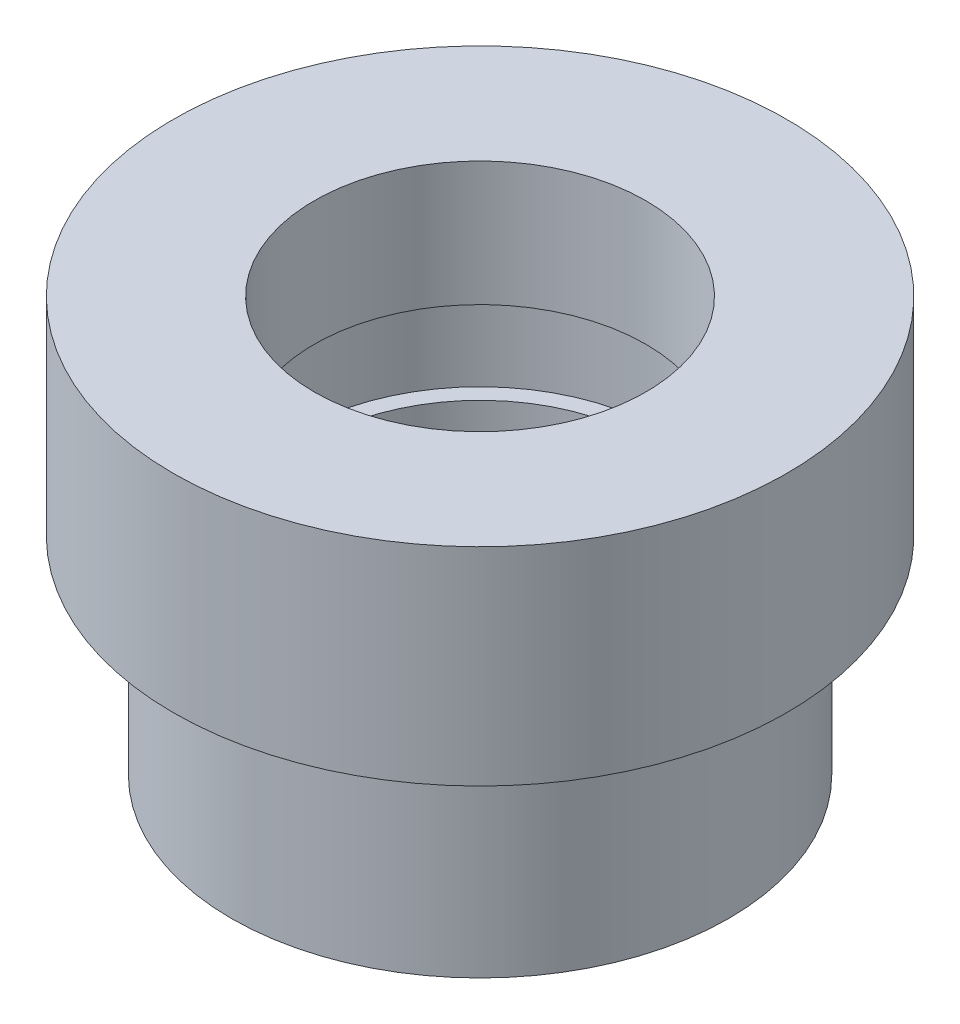
ISO-10303-21;
HEADER;
FILE_DESCRIPTION(('STEP AP214'),'2;1');
FILE_NAME('part.step','',(''),(''),'','','');
FILE_SCHEMA(('AUTOMOTIVE_DESIGN { 1 0 10303 214 1 1 1 1 }'));
ENDSEC;
DATA;
#1=APPLICATION_CONTEXT('core data for automotive mechanical design processes');
#2=APPLICATION_PROTOCOL_DEFINITION('international standard','automotive_design',2000,#1);
#3=PRODUCT_CONTEXT('',#1,'mechanical');
#4=PRODUCT('Part','Part','',(#3));
#5=PRODUCT_RELATED_PRODUCT_CATEGORY('part','',(#4));
#6=PRODUCT_DEFINITION_FORMATION('','',#4);
#7=PRODUCT_DEFINITION_CONTEXT('part definition',#1,'design');
#8=PRODUCT_DEFINITION('design','',#6,#7);
#9=PRODUCT_DEFINITION_SHAPE('','',#8);
#10=(LENGTH_UNIT() NAMED_UNIT(*) SI_UNIT(.MILLI.,.METRE.));
#11=(NAMED_UNIT(*) PLANE_ANGLE_UNIT() SI_UNIT($,.RADIAN.));
#12=(NAMED_UNIT(*) SI_UNIT($,.STERADIAN.) SOLID_ANGLE_UNIT());
#13=UNCERTAINTY_MEASURE_WITH_UNIT(LENGTH_MEASURE(1.E-05),#10,'distance_accuracy_value','');
#14=(GEOMETRIC_REPRESENTATION_CONTEXT(3) GLOBAL_UNCERTAINTY_ASSIGNED_CONTEXT((#13)) GLOBAL_UNIT_ASSIGNED_CONTEXT((#10,
#11,#12)) REPRESENTATION_CONTEXT('',''));
#15=CARTESIAN_POINT('',(0.,0.,0.));
#16=DIRECTION('',(0.,0.,1.));
#17=DIRECTION('',(1.,0.,0.));
#18=AXIS2_PLACEMENT_3D('',#15,#16,#17);
#19=CARTESIAN_POINT('',(0.,14.2533936651584,0.));
#20=DIRECTION('',(0.,1.,0.));
#21=DIRECTION('',(0.,0.,1.));
#22=AXIS2_PLACEMENT_3D('',#19,#20,#21);
#23=CYLINDRICAL_SURFACE('',#22,37.);
#24=CARTESIAN_POINT('',(0.,25.,0.));
#25=DIRECTION('',(0.,1.,0.));
#26=DIRECTION('',(0.,0.,1.));
#27=AXIS2_PLACEMENT_3D('',#24,#25,#26);
#28=CIRCLE('',#27,37.);
#29=CARTESIAN_POINT('',(0.,25.,37.));
#30=VERTEX_POINT('',#29);
#31=EDGE_CURVE('E10',#30,#30,#28,.T.);
#32=ORIENTED_EDGE('',*,*,#31,.F.);
#33=EDGE_LOOP('',(#32));
#34=FACE_BOUND('',#33,.T.);
#35=CARTESIAN_POINT('',(0.,0.,0.));
#36=DIRECTION('',(0.,1.,0.));
#37=DIRECTION('',(0.,0.,1.));
#38=AXIS2_PLACEMENT_3D('',#35,#36,#37);
#39=CIRCLE('',#38,37.);
#40=CARTESIAN_POINT('',(0.,0.,37.));
#41=VERTEX_POINT('',#40);
#42=EDGE_CURVE('E67',#41,#41,#39,.T.);
#43=ORIENTED_EDGE('',*,*,#42,.T.);
#44=EDGE_LOOP('',(#43));
#45=FACE_BOUND('',#44,.T.);
#46=ADVANCED_FACE('F33',(#34,#45),#23,.T.);
#47=CARTESIAN_POINT('',(-37.,25.,0.));
#48=DIRECTION('',(0.,-1.,0.));
#49=DIRECTION('',(0.,0.,-1.));
#50=AXIS2_PLACEMENT_3D('',#47,#48,#49);
#51=PLANE('',#50);
#52=CARTESIAN_POINT('',(0.,25.,0.));
#53=DIRECTION('',(0.,1.,0.));
#54=DIRECTION('',(0.,0.,1.));
#55=AXIS2_PLACEMENT_3D('',#52,#53,#54);
#56=CIRCLE('',#55,20.);
#57=CARTESIAN_POINT('',(0.,25.,20.));
#58=VERTEX_POINT('',#57);
#59=EDGE_CURVE('E39',#58,#58,#56,.T.);
#60=ORIENTED_EDGE('',*,*,#59,.F.);
#61=EDGE_LOOP('',(#60));
#62=FACE_BOUND('',#61,.T.);
#63=ORIENTED_EDGE('',*,*,#31,.T.);
#64=EDGE_LOOP('',(#63));
#65=FACE_BOUND('',#64,.T.);
#66=ADVANCED_FACE('F116',(#62,#65),#51,.F.);
#67=CARTESIAN_POINT('',(0.,14.2533936651584,0.));
#68=DIRECTION('',(0.,1.,0.));
#69=DIRECTION('',(0.,0.,1.));
#70=AXIS2_PLACEMENT_3D('',#67,#68,#69);
#71=CYLINDRICAL_SURFACE('',#70,20.);
#72=CARTESIAN_POINT('',(0.,10.,0.));
#73=DIRECTION('',(0.,1.,0.));
#74=DIRECTION('',(0.,0.,1.));
#75=AXIS2_PLACEMENT_3D('',#72,#73,#74);
#76=CIRCLE('',#75,20.);
#77=CARTESIAN_POINT('',(0.,10.,20.));
#78=VERTEX_POINT('',#77);
#79=EDGE_CURVE('E43',#78,#78,#76,.T.);
#80=ORIENTED_EDGE('',*,*,#79,.F.);
#81=EDGE_LOOP('',(#80));
#82=FACE_BOUND('',#81,.T.);
#83=ORIENTED_EDGE('',*,*,#59,.T.);
#84=EDGE_LOOP('',(#83));
#85=FACE_BOUND('',#84,.T.);
#86=ADVANCED_FACE('F111',(#82,#85),#71,.F.);
#87=CARTESIAN_POINT('',(-20.,10.,0.));
#88=DIRECTION('',(0.,1.,0.));
#89=DIRECTION('',(0.,0.,1.));
#90=AXIS2_PLACEMENT_3D('',#87,#88,#89);
#91=PLANE('',#90);
#92=CARTESIAN_POINT('',(0.,10.,0.));
#93=DIRECTION('',(0.,1.,0.));
#94=DIRECTION('',(0.,0.,1.));
#95=AXIS2_PLACEMENT_3D('',#92,#93,#94);
#96=CIRCLE('',#95,22.);
#97=CARTESIAN_POINT('',(0.,10.,22.));
#98=VERTEX_POINT('',#97);
#99=EDGE_CURVE('E47',#98,#98,#96,.T.);
#100=ORIENTED_EDGE('',*,*,#99,.F.);
#101=EDGE_LOOP('',(#100));
#102=FACE_BOUND('',#101,.T.);
#103=ORIENTED_EDGE('',*,*,#79,.T.);
#104=EDGE_LOOP('',(#103));
#105=FACE_BOUND('',#104,.T.);
#106=ADVANCED_FACE('F105',(#102,#105),#91,.F.);
#107=CARTESIAN_POINT('',(0.,14.2533936651584,0.));
#108=DIRECTION('',(0.,1.,0.));
#109=DIRECTION('',(0.,0.,1.));
#110=AXIS2_PLACEMENT_3D('',#107,#108,#109);
#111=CYLINDRICAL_SURFACE('',#110,22.);
#112=CARTESIAN_POINT('',(0.,0.,0.));
#113=DIRECTION('',(0.,1.,0.));
#114=DIRECTION('',(0.,0.,1.));
#115=AXIS2_PLACEMENT_3D('',#112,#113,#114);
#116=CIRCLE('',#115,22.);
#117=CARTESIAN_POINT('',(0.,0.,22.));
#118=VERTEX_POINT('',#117);
#119=EDGE_CURVE('E52',#118,#118,#116,.T.);
#120=ORIENTED_EDGE('',*,*,#119,.F.);
#121=EDGE_LOOP('',(#120));
#122=FACE_BOUND('',#121,.T.);
#123=ORIENTED_EDGE('',*,*,#99,.T.);
#124=EDGE_LOOP('',(#123));
#125=FACE_BOUND('',#124,.T.);
#126=ADVANCED_FACE('F99',(#122,#125),#111,.F.);
#127=CARTESIAN_POINT('',(-22.,0.,0.));
#128=DIRECTION('',(0.,-1.,0.));
#129=DIRECTION('',(0.,0.,-1.));
#130=AXIS2_PLACEMENT_3D('',#127,#128,#129);
#131=PLANE('',#130);
#132=CARTESIAN_POINT('',(0.,0.,0.));
#133=DIRECTION('',(0.,1.,0.));
#134=DIRECTION('',(0.,0.,1.));
#135=AXIS2_PLACEMENT_3D('',#132,#133,#134);
#136=CIRCLE('',#135,20.);
#137=CARTESIAN_POINT('',(0.,0.,20.));
#138=VERTEX_POINT('',#137);
#139=EDGE_CURVE('E55',#138,#138,#136,.T.);
#140=ORIENTED_EDGE('',*,*,#139,.F.);
#141=EDGE_LOOP('',(#140));
#142=FACE_BOUND('',#141,.T.);
#143=ORIENTED_EDGE('',*,*,#119,.T.);
#144=EDGE_LOOP('',(#143));
#145=FACE_BOUND('',#144,.T.);
#146=ADVANCED_FACE('F93',(#142,#145),#131,.F.);
#147=CARTESIAN_POINT('',(0.,14.2533936651584,0.));
#148=DIRECTION('',(0.,1.,0.));
#149=DIRECTION('',(0.,0.,1.));
#150=AXIS2_PLACEMENT_3D('',#147,#148,#149);
#151=CYLINDRICAL_SURFACE('',#150,20.);
#152=CARTESIAN_POINT('',(0.,-25.,0.));
#153=DIRECTION('',(0.,1.,0.));
#154=DIRECTION('',(0.,0.,1.));
#155=AXIS2_PLACEMENT_3D('',#152,#153,#154);
#156=CIRCLE('',#155,20.);
#157=CARTESIAN_POINT('',(0.,-25.,20.));
#158=VERTEX_POINT('',#157);
#159=EDGE_CURVE('E58',#158,#158,#156,.T.);
#160=ORIENTED_EDGE('',*,*,#159,.F.);
#161=EDGE_LOOP('',(#160));
#162=FACE_BOUND('',#161,.T.);
#163=ORIENTED_EDGE('',*,*,#139,.T.);
#164=EDGE_LOOP('',(#163));
#165=FACE_BOUND('',#164,.T.);
#166=ADVANCED_FACE('F87',(#162,#165),#151,.F.);
#167=CARTESIAN_POINT('',(-20.,-25.,0.));
#168=DIRECTION('',(0.,1.,0.));
#169=DIRECTION('',(0.,0.,1.));
#170=AXIS2_PLACEMENT_3D('',#167,#168,#169);
#171=PLANE('',#170);
#172=CARTESIAN_POINT('',(0.,-25.,0.));
#173=DIRECTION('',(0.,1.,0.));
#174=DIRECTION('',(0.,0.,1.));
#175=AXIS2_PLACEMENT_3D('',#172,#173,#174);
#176=CIRCLE('',#175,30.);
#177=CARTESIAN_POINT('',(0.,-25.,30.));
#178=VERTEX_POINT('',#177);
#179=EDGE_CURVE('E61',#178,#178,#176,.T.);
#180=ORIENTED_EDGE('',*,*,#179,.F.);
#181=EDGE_LOOP('',(#180));
#182=FACE_BOUND('',#181,.T.);
#183=ORIENTED_EDGE('',*,*,#159,.T.);
#184=EDGE_LOOP('',(#183));
#185=FACE_BOUND('',#184,.T.);
#186=ADVANCED_FACE('F81',(#182,#185),#171,.F.);
#187=CARTESIAN_POINT('',(0.,14.2533936651584,0.));
#188=DIRECTION('',(0.,1.,0.));
#189=DIRECTION('',(0.,0.,1.));
#190=AXIS2_PLACEMENT_3D('',#187,#188,#189);
#191=CYLINDRICAL_SURFACE('',#190,30.);
#192=CARTESIAN_POINT('',(0.,0.,0.));
#193=DIRECTION('',(0.,1.,0.));
#194=DIRECTION('',(0.,0.,1.));
#195=AXIS2_PLACEMENT_3D('',#192,#193,#194);
#196=CIRCLE('',#195,30.);
#197=CARTESIAN_POINT('',(0.,0.,30.));
#198=VERTEX_POINT('',#197);
#199=EDGE_CURVE('E64',#198,#198,#196,.T.);
#200=ORIENTED_EDGE('',*,*,#199,.F.);
#201=EDGE_LOOP('',(#200));
#202=FACE_BOUND('',#201,.T.);
#203=ORIENTED_EDGE('',*,*,#179,.T.);
#204=EDGE_LOOP('',(#203));
#205=FACE_BOUND('',#204,.T.);
#206=ADVANCED_FACE('F75',(#202,#205),#191,.T.);
#207=CARTESIAN_POINT('',(-30.,0.,0.));
#208=DIRECTION('',(0.,1.,0.));
#209=DIRECTION('',(0.,0.,1.));
#210=AXIS2_PLACEMENT_3D('',#207,#208,#209);
#211=PLANE('',#210);
#212=ORIENTED_EDGE('',*,*,#42,.F.);
#213=EDGE_LOOP('',(#212));
#214=FACE_BOUND('',#213,.T.);
#215=ORIENTED_EDGE('',*,*,#199,.T.);
#216=EDGE_LOOP('',(#215));
#217=FACE_BOUND('',#216,.T.);
#218=ADVANCED_FACE('F72',(#214,#217),#211,.F.);
#219=CLOSED_SHELL('',(#46,#66,#86,#106,#126,#146,#166,#186,#206,#218));
#220=MANIFOLD_SOLID_BREP('B2',#219);
#221=ADVANCED_BREP_SHAPE_REPRESENTATION('',(#18,#220),#14);
#222=SHAPE_DEFINITION_REPRESENTATION(#9,#221);
ENDSEC;
END-ISO-10303-21;
